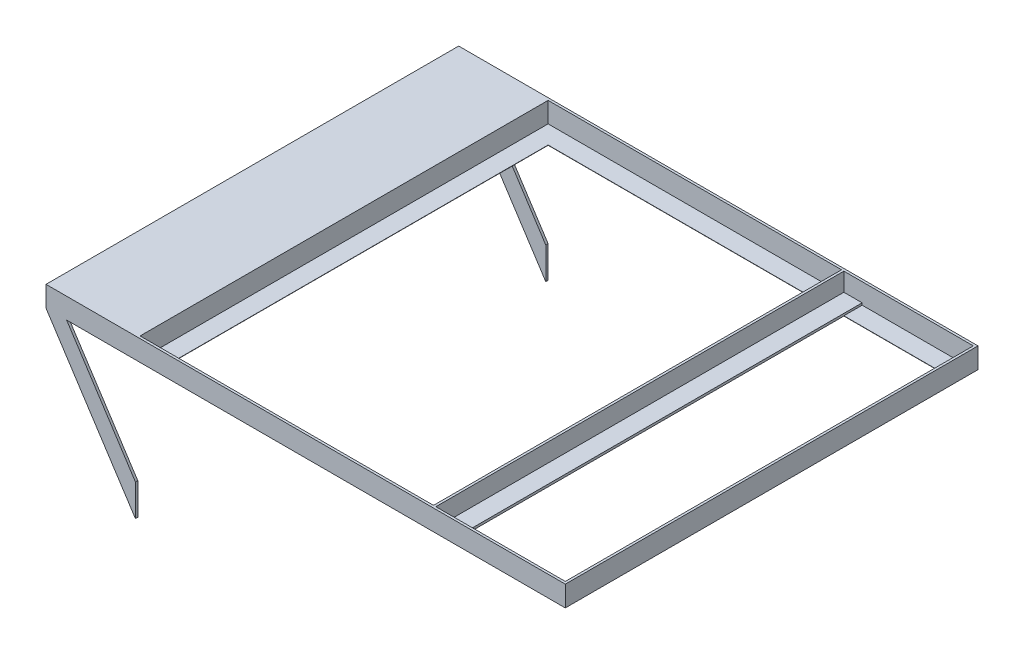
ISO-10303-21;
HEADER;
FILE_DESCRIPTION(('STEP AP214'),'2;1');
FILE_NAME('part.step','',(''),(''),'','','');
FILE_SCHEMA(('AUTOMOTIVE_DESIGN { 1 0 10303 214 1 1 1 1 }'));
ENDSEC;
DATA;
#1=APPLICATION_CONTEXT('core data for automotive mechanical design processes');
#2=APPLICATION_PROTOCOL_DEFINITION('international standard','automotive_design',2000,#1);
#3=PRODUCT_CONTEXT('',#1,'mechanical');
#4=PRODUCT('Part','Part','',(#3));
#5=PRODUCT_RELATED_PRODUCT_CATEGORY('part','',(#4));
#6=PRODUCT_DEFINITION_FORMATION('','',#4);
#7=PRODUCT_DEFINITION_CONTEXT('part definition',#1,'design');
#8=PRODUCT_DEFINITION('design','',#6,#7);
#9=PRODUCT_DEFINITION_SHAPE('','',#8);
#10=(LENGTH_UNIT() NAMED_UNIT(*) SI_UNIT(.MILLI.,.METRE.));
#11=(NAMED_UNIT(*) PLANE_ANGLE_UNIT() SI_UNIT($,.RADIAN.));
#12=(NAMED_UNIT(*) SI_UNIT($,.STERADIAN.) SOLID_ANGLE_UNIT());
#13=UNCERTAINTY_MEASURE_WITH_UNIT(LENGTH_MEASURE(1.E-05),#10,'distance_accuracy_value','');
#14=(GEOMETRIC_REPRESENTATION_CONTEXT(3) GLOBAL_UNCERTAINTY_ASSIGNED_CONTEXT((#13)) GLOBAL_UNIT_ASSIGNED_CONTEXT((#10,
#11,#12)) REPRESENTATION_CONTEXT('',''));
#15=CARTESIAN_POINT('',(0.,0.,0.));
#16=DIRECTION('',(0.,0.,1.));
#17=DIRECTION('',(1.,0.,0.));
#18=AXIS2_PLACEMENT_3D('',#15,#16,#17);
#19=CARTESIAN_POINT('',(0.,0.,0.));
#20=DIRECTION('',(0.,1.,0.));
#21=DIRECTION('',(0.,0.,1.));
#22=AXIS2_PLACEMENT_3D('',#19,#20,#21);
#23=PLANE('',#22);
#24=DIRECTION('',(0.,0.,1.));
#25=VECTOR('',#24,1.);
#26=CARTESIAN_POINT('',(182.5,0.,-300.));
#27=LINE('',#26,#25);
#28=CARTESIAN_POINT('',(182.5,0.,-270.));
#29=VERTEX_POINT('',#28);
#30=CARTESIAN_POINT('',(182.5,0.,270.));
#31=VERTEX_POINT('',#30);
#32=EDGE_CURVE('E340',#29,#31,#27,.T.);
#33=ORIENTED_EDGE('',*,*,#32,.F.);
#34=DIRECTION('',(1.,0.,0.));
#35=VECTOR('',#34,1.);
#36=CARTESIAN_POINT('',(0.,0.,-270.));
#37=LINE('',#36,#35);
#38=CARTESIAN_POINT('',(-217.5,0.,-270.));
#39=VERTEX_POINT('',#38);
#40=EDGE_CURVE('E513',#39,#29,#37,.T.);
#41=ORIENTED_EDGE('',*,*,#40,.F.);
#42=DIRECTION('',(0.,0.,1.));
#43=VECTOR('',#42,1.);
#44=CARTESIAN_POINT('',(-217.5,0.,0.));
#45=LINE('',#44,#43);
#46=CARTESIAN_POINT('',(-217.5,0.,270.));
#47=VERTEX_POINT('',#46);
#48=EDGE_CURVE('E516',#39,#47,#45,.T.);
#49=ORIENTED_EDGE('',*,*,#48,.T.);
#50=DIRECTION('',(1.,0.,0.));
#51=VECTOR('',#50,1.);
#52=CARTESIAN_POINT('',(0.,0.,270.));
#53=LINE('',#52,#51);
#54=EDGE_CURVE('E521',#47,#31,#53,.T.);
#55=ORIENTED_EDGE('',*,*,#54,.T.);
#56=EDGE_LOOP('',(#33,#41,#49,#55));
#57=FACE_BOUND('',#56,.T.);
#58=DIRECTION('',(0.,0.,1.));
#59=VECTOR('',#58,1.);
#60=CARTESIAN_POINT('',(212.5,0.,-300.));
#61=LINE('',#60,#59);
#62=CARTESIAN_POINT('',(212.5,0.,-270.));
#63=VERTEX_POINT('',#62);
#64=CARTESIAN_POINT('',(212.5,0.,270.));
#65=VERTEX_POINT('',#64);
#66=EDGE_CURVE('E336',#63,#65,#61,.T.);
#67=ORIENTED_EDGE('',*,*,#66,.T.);
#68=CARTESIAN_POINT('',(347.5,0.,270.));
#69=VERTEX_POINT('',#68);
#70=EDGE_CURVE('E520',#65,#69,#53,.T.);
#71=ORIENTED_EDGE('',*,*,#70,.T.);
#72=DIRECTION('',(0.,0.,1.));
#73=VECTOR('',#72,1.);
#74=CARTESIAN_POINT('',(347.5,0.,0.));
#75=LINE('',#74,#73);
#76=CARTESIAN_POINT('',(347.5,0.,-270.));
#77=VERTEX_POINT('',#76);
#78=EDGE_CURVE('E525',#77,#69,#75,.T.);
#79=ORIENTED_EDGE('',*,*,#78,.F.);
#80=EDGE_CURVE('E512',#63,#77,#37,.T.);
#81=ORIENTED_EDGE('',*,*,#80,.F.);
#82=EDGE_LOOP('',(#67,#71,#79,#81));
#83=FACE_BOUND('',#82,.T.);
#84=DIRECTION('',(-1.,0.,0.));
#85=VECTOR('',#84,1.);
#86=CARTESIAN_POINT('',(0.,0.,-296.6));
#87=LINE('',#86,#85);
#88=CARTESIAN_POINT('',(-347.5,0.,-296.6));
#89=VERTEX_POINT('',#88);
#90=CARTESIAN_POINT('',(-377.5,0.,-296.6));
#91=VERTEX_POINT('',#90);
#92=EDGE_CURVE('E251',#89,#91,#87,.T.);
#93=ORIENTED_EDGE('',*,*,#92,.F.);
#94=DIRECTION('',(0.,0.,-1.));
#95=VECTOR('',#94,1.);
#96=CARTESIAN_POINT('',(-347.5,0.,-296.6));
#97=LINE('',#96,#95);
#98=CARTESIAN_POINT('',(-347.5,0.,-300.));
#99=VERTEX_POINT('',#98);
#100=EDGE_CURVE('E262',#89,#99,#97,.T.);
#101=ORIENTED_EDGE('',*,*,#100,.T.);
#102=DIRECTION('',(-1.,0.,0.));
#103=VECTOR('',#102,1.);
#104=CARTESIAN_POINT('',(-377.5,0.,-300.));
#105=LINE('',#104,#103);
#106=CARTESIAN_POINT('',(377.5,0.,-300.));
#107=VERTEX_POINT('',#106);
#108=EDGE_CURVE('E488',#107,#99,#105,.T.);
#109=ORIENTED_EDGE('',*,*,#108,.F.);
#110=DIRECTION('',(0.,0.,-1.));
#111=VECTOR('',#110,1.);
#112=CARTESIAN_POINT('',(377.5,0.,-300.));
#113=LINE('',#112,#111);
#114=CARTESIAN_POINT('',(377.5,0.,300.));
#115=VERTEX_POINT('',#114);
#116=EDGE_CURVE('E460',#115,#107,#113,.T.);
#117=ORIENTED_EDGE('',*,*,#116,.F.);
#118=DIRECTION('',(1.,0.,0.));
#119=VECTOR('',#118,1.);
#120=CARTESIAN_POINT('',(-377.5,0.,300.));
#121=LINE('',#120,#119);
#122=CARTESIAN_POINT('',(-347.5,0.,300.));
#123=VERTEX_POINT('',#122);
#124=EDGE_CURVE('E475',#123,#115,#121,.T.);
#125=ORIENTED_EDGE('',*,*,#124,.F.);
#126=DIRECTION('',(0.,0.,1.));
#127=VECTOR('',#126,1.);
#128=CARTESIAN_POINT('',(-347.5,0.,296.6));
#129=LINE('',#128,#127);
#130=CARTESIAN_POINT('',(-347.5,0.,296.6));
#131=VERTEX_POINT('',#130);
#132=EDGE_CURVE('E301',#131,#123,#129,.T.);
#133=ORIENTED_EDGE('',*,*,#132,.F.);
#134=DIRECTION('',(-1.,0.,0.));
#135=VECTOR('',#134,1.);
#136=CARTESIAN_POINT('',(-377.5,0.,296.6));
#137=LINE('',#136,#135);
#138=CARTESIAN_POINT('',(-377.5,0.,296.6));
#139=VERTEX_POINT('',#138);
#140=EDGE_CURVE('E288',#131,#139,#137,.T.);
#141=ORIENTED_EDGE('',*,*,#140,.T.);
#142=DIRECTION('',(0.,0.,1.));
#143=VECTOR('',#142,1.);
#144=CARTESIAN_POINT('',(-377.5,0.,-300.));
#145=LINE('',#144,#143);
#146=EDGE_CURVE('E70',#91,#139,#145,.T.);
#147=ORIENTED_EDGE('',*,*,#146,.F.);
#148=EDGE_LOOP('',(#93,#101,#109,#117,#125,#133,#141,#147));
#149=FACE_BOUND('',#148,.T.);
#150=ADVANCED_FACE('F46',(#57,#83,#149),#23,.F.);
#151=CARTESIAN_POINT('',(0.,0.399999999999998,0.));
#152=DIRECTION('',(0.,1.,0.));
#153=DIRECTION('',(0.,0.,1.));
#154=AXIS2_PLACEMENT_3D('',#151,#152,#153);
#155=PLANE('',#154);
#156=DIRECTION('',(0.,0.,-1.));
#157=VECTOR('',#156,1.);
#158=CARTESIAN_POINT('',(212.5,0.399999999999998,0.));
#159=LINE('',#158,#157);
#160=CARTESIAN_POINT('',(212.5,0.399999999999998,296.6));
#161=VERTEX_POINT('',#160);
#162=CARTESIAN_POINT('',(212.5,0.399999999999998,270.));
#163=VERTEX_POINT('',#162);
#164=EDGE_CURVE('E367',#161,#163,#159,.T.);
#165=ORIENTED_EDGE('',*,*,#164,.F.);
#166=DIRECTION('',(1.,0.,0.));
#167=VECTOR('',#166,1.);
#168=CARTESIAN_POINT('',(0.,0.399999999999998,296.6));
#169=LINE('',#168,#167);
#170=CARTESIAN_POINT('',(374.1,0.399999999999998,296.6));
#171=VERTEX_POINT('',#170);
#172=EDGE_CURVE('E434',#161,#171,#169,.T.);
#173=ORIENTED_EDGE('',*,*,#172,.T.);
#174=DIRECTION('',(0.,0.,1.));
#175=VECTOR('',#174,1.);
#176=CARTESIAN_POINT('',(374.1,0.399999999999998,0.));
#177=LINE('',#176,#175);
#178=CARTESIAN_POINT('',(374.1,0.399999999999998,-296.6));
#179=VERTEX_POINT('',#178);
#180=EDGE_CURVE('E420',#179,#171,#177,.T.);
#181=ORIENTED_EDGE('',*,*,#180,.F.);
#182=DIRECTION('',(1.,0.,0.));
#183=VECTOR('',#182,1.);
#184=CARTESIAN_POINT('',(0.,0.399999999999998,-296.6));
#185=LINE('',#184,#183);
#186=CARTESIAN_POINT('',(212.5,0.399999999999998,-296.6));
#187=VERTEX_POINT('',#186);
#188=EDGE_CURVE('E424',#187,#179,#185,.T.);
#189=ORIENTED_EDGE('',*,*,#188,.F.);
#190=CARTESIAN_POINT('',(212.5,0.399999999999998,-270.));
#191=VERTEX_POINT('',#190);
#192=EDGE_CURVE('E362',#191,#187,#159,.T.);
#193=ORIENTED_EDGE('',*,*,#192,.F.);
#194=DIRECTION('',(1.,0.,0.));
#195=VECTOR('',#194,1.);
#196=CARTESIAN_POINT('',(0.,0.399999999999998,-270.));
#197=LINE('',#196,#195);
#198=CARTESIAN_POINT('',(347.5,0.399999999999998,-270.));
#199=VERTEX_POINT('',#198);
#200=EDGE_CURVE('E391',#191,#199,#197,.T.);
#201=ORIENTED_EDGE('',*,*,#200,.T.);
#202=DIRECTION('',(0.,0.,1.));
#203=VECTOR('',#202,1.);
#204=CARTESIAN_POINT('',(347.5,0.399999999999998,0.));
#205=LINE('',#204,#203);
#206=CARTESIAN_POINT('',(347.5,0.399999999999998,270.));
#207=VERTEX_POINT('',#206);
#208=EDGE_CURVE('E387',#199,#207,#205,.T.);
#209=ORIENTED_EDGE('',*,*,#208,.T.);
#210=DIRECTION('',(1.,0.,0.));
#211=VECTOR('',#210,1.);
#212=CARTESIAN_POINT('',(0.,0.399999999999998,270.));
#213=LINE('',#212,#211);
#214=EDGE_CURVE('E399',#163,#207,#213,.T.);
#215=ORIENTED_EDGE('',*,*,#214,.F.);
#216=EDGE_LOOP('',(#165,#173,#181,#189,#193,#201,#209,#215));
#217=FACE_BOUND('',#216,.T.);
#218=ADVANCED_FACE('F596',(#217),#155,.T.);
#219=CARTESIAN_POINT('',(0.,0.399999999999998,296.6));
#220=DIRECTION('',(0.,0.,1.));
#221=DIRECTION('',(1.,0.,0.));
#222=AXIS2_PLACEMENT_3D('',#219,#220,#221);
#223=PLANE('',#222);
#224=DIRECTION('',(-1.,0.,0.));
#225=VECTOR('',#224,1.);
#226=CARTESIAN_POINT('',(0.,3.4,296.6));
#227=LINE('',#226,#225);
#228=CARTESIAN_POINT('',(212.5,3.4,296.6));
#229=VERTEX_POINT('',#228);
#230=CARTESIAN_POINT('',(185.9,3.4,296.6));
#231=VERTEX_POINT('',#230);
#232=EDGE_CURVE('E379',#229,#231,#227,.T.);
#233=ORIENTED_EDGE('',*,*,#232,.T.);
#234=DIRECTION('',(0.,1.,0.));
#235=VECTOR('',#234,1.);
#236=CARTESIAN_POINT('',(185.9,0.399999999999998,296.6));
#237=LINE('',#236,#235);
#238=CARTESIAN_POINT('',(185.9,30.,296.6));
#239=VERTEX_POINT('',#238);
#240=EDGE_CURVE('E383',#231,#239,#237,.T.);
#241=ORIENTED_EDGE('',*,*,#240,.T.);
#242=DIRECTION('',(1.,0.,0.));
#243=VECTOR('',#242,1.);
#244=CARTESIAN_POINT('',(0.,30.,296.6));
#245=LINE('',#244,#243);
#246=CARTESIAN_POINT('',(374.1,30.,296.6));
#247=VERTEX_POINT('',#246);
#248=EDGE_CURVE('E452',#239,#247,#245,.T.);
#249=ORIENTED_EDGE('',*,*,#248,.T.);
#250=DIRECTION('',(0.,1.,0.));
#251=VECTOR('',#250,1.);
#252=CARTESIAN_POINT('',(374.1,0.399999999999998,296.6));
#253=LINE('',#252,#251);
#254=EDGE_CURVE('E456',#171,#247,#253,.T.);
#255=ORIENTED_EDGE('',*,*,#254,.F.);
#256=ORIENTED_EDGE('',*,*,#172,.F.);
#257=DIRECTION('',(0.,1.,0.));
#258=VECTOR('',#257,1.);
#259=CARTESIAN_POINT('',(212.5,0.399999999999998,296.6));
#260=LINE('',#259,#258);
#261=EDGE_CURVE('E375',#161,#229,#260,.T.);
#262=ORIENTED_EDGE('',*,*,#261,.T.);
#263=EDGE_LOOP('',(#233,#241,#249,#255,#256,#262));
#264=FACE_BOUND('',#263,.T.);
#265=ADVANCED_FACE('F548',(#264),#223,.F.);
#266=CARTESIAN_POINT('',(0.,0.399999999999998,-296.6));
#267=DIRECTION('',(0.,0.,1.));
#268=DIRECTION('',(1.,0.,0.));
#269=AXIS2_PLACEMENT_3D('',#266,#267,#268);
#270=PLANE('',#269);
#271=DIRECTION('',(0.,1.,0.));
#272=VECTOR('',#271,1.);
#273=CARTESIAN_POINT('',(185.9,0.399999999999998,-296.6));
#274=LINE('',#273,#272);
#275=CARTESIAN_POINT('',(185.9,3.4,-296.6));
#276=VERTEX_POINT('',#275);
#277=CARTESIAN_POINT('',(185.9,30.,-296.6));
#278=VERTEX_POINT('',#277);
#279=EDGE_CURVE('E11',#276,#278,#274,.T.);
#280=ORIENTED_EDGE('',*,*,#279,.F.);
#281=DIRECTION('',(-1.,0.,0.));
#282=VECTOR('',#281,1.);
#283=CARTESIAN_POINT('',(0.,3.4,-296.6));
#284=LINE('',#283,#282);
#285=CARTESIAN_POINT('',(212.5,3.4,-296.6));
#286=VERTEX_POINT('',#285);
#287=EDGE_CURVE('E55',#286,#276,#284,.T.);
#288=ORIENTED_EDGE('',*,*,#287,.F.);
#289=DIRECTION('',(0.,1.,0.));
#290=VECTOR('',#289,1.);
#291=CARTESIAN_POINT('',(212.5,0.399999999999998,-296.6));
#292=LINE('',#291,#290);
#293=EDGE_CURVE('E366',#187,#286,#292,.T.);
#294=ORIENTED_EDGE('',*,*,#293,.F.);
#295=ORIENTED_EDGE('',*,*,#188,.T.);
#296=DIRECTION('',(0.,1.,0.));
#297=VECTOR('',#296,1.);
#298=CARTESIAN_POINT('',(374.1,0.399999999999998,-296.6));
#299=LINE('',#298,#297);
#300=CARTESIAN_POINT('',(374.1,30.,-296.6));
#301=VERTEX_POINT('',#300);
#302=EDGE_CURVE('E439',#179,#301,#299,.T.);
#303=ORIENTED_EDGE('',*,*,#302,.T.);
#304=DIRECTION('',(1.,0.,0.));
#305=VECTOR('',#304,1.);
#306=CARTESIAN_POINT('',(0.,30.,-296.6));
#307=LINE('',#306,#305);
#308=EDGE_CURVE('E443',#278,#301,#307,.T.);
#309=ORIENTED_EDGE('',*,*,#308,.F.);
#310=EDGE_LOOP('',(#280,#288,#294,#295,#303,#309));
#311=FACE_BOUND('',#310,.T.);
#312=ADVANCED_FACE('F583',(#311),#270,.T.);
#313=CARTESIAN_POINT('',(0.,-29.2,270.));
#314=DIRECTION('',(0.,0.,1.));
#315=DIRECTION('',(1.,0.,0.));
#316=AXIS2_PLACEMENT_3D('',#313,#314,#315);
#317=PLANE('',#316);
#318=ORIENTED_EDGE('',*,*,#70,.F.);
#319=DIRECTION('',(0.,1.,0.));
#320=VECTOR('',#319,1.);
#321=CARTESIAN_POINT('',(212.5,-29.2,270.));
#322=LINE('',#321,#320);
#323=EDGE_CURVE('E371',#65,#163,#322,.T.);
#324=ORIENTED_EDGE('',*,*,#323,.T.);
#325=ORIENTED_EDGE('',*,*,#214,.T.);
#326=DIRECTION('',(0.,1.,0.));
#327=VECTOR('',#326,1.);
#328=CARTESIAN_POINT('',(347.5,-29.2,270.));
#329=LINE('',#328,#327);
#330=EDGE_CURVE('E405',#69,#207,#329,.T.);
#331=ORIENTED_EDGE('',*,*,#330,.F.);
#332=EDGE_LOOP('',(#318,#324,#325,#331));
#333=FACE_BOUND('',#332,.T.);
#334=ADVANCED_FACE('F594',(#333),#317,.F.);
#335=CARTESIAN_POINT('',(0.,-29.2,-270.));
#336=DIRECTION('',(0.,0.,1.));
#337=DIRECTION('',(1.,0.,0.));
#338=AXIS2_PLACEMENT_3D('',#335,#336,#337);
#339=PLANE('',#338);
#340=DIRECTION('',(0.,1.,0.));
#341=VECTOR('',#340,1.);
#342=CARTESIAN_POINT('',(212.5,-29.2,-270.));
#343=LINE('',#342,#341);
#344=EDGE_CURVE('E533',#63,#191,#343,.T.);
#345=ORIENTED_EDGE('',*,*,#344,.F.);
#346=ORIENTED_EDGE('',*,*,#80,.T.);
#347=DIRECTION('',(0.,1.,0.));
#348=VECTOR('',#347,1.);
#349=CARTESIAN_POINT('',(347.5,-29.2,-270.));
#350=LINE('',#349,#348);
#351=EDGE_CURVE('E404',#77,#199,#350,.T.);
#352=ORIENTED_EDGE('',*,*,#351,.T.);
#353=ORIENTED_EDGE('',*,*,#200,.F.);
#354=EDGE_LOOP('',(#345,#346,#352,#353));
#355=FACE_BOUND('',#354,.T.);
#356=ADVANCED_FACE('F682',(#355),#339,.T.);
#357=DIRECTION('',(0.,0.,1.));
#358=VECTOR('',#357,1.);
#359=CARTESIAN_POINT('',(182.5,0.399999999999998,0.));
#360=LINE('',#359,#358);
#361=CARTESIAN_POINT('',(182.5,0.399999999999998,-296.6));
#362=VERTEX_POINT('',#361);
#363=CARTESIAN_POINT('',(182.5,0.399999999999998,-270.));
#364=VERTEX_POINT('',#363);
#365=EDGE_CURVE('E327',#362,#364,#360,.T.);
#366=ORIENTED_EDGE('',*,*,#365,.F.);
#367=CARTESIAN_POINT('',(-244.1,0.399999999999998,-296.6));
#368=VERTEX_POINT('',#367);
#369=EDGE_CURVE('E426',#368,#362,#185,.T.);
#370=ORIENTED_EDGE('',*,*,#369,.F.);
#371=DIRECTION('',(0.,0.,1.));
#372=VECTOR('',#371,1.);
#373=CARTESIAN_POINT('',(-244.1,0.399999999999998,0.));
#374=LINE('',#373,#372);
#375=CARTESIAN_POINT('',(-244.1,0.399999999999998,296.6));
#376=VERTEX_POINT('',#375);
#377=EDGE_CURVE('E430',#368,#376,#374,.T.);
#378=ORIENTED_EDGE('',*,*,#377,.T.);
#379=CARTESIAN_POINT('',(182.5,0.399999999999998,296.6));
#380=VERTEX_POINT('',#379);
#381=EDGE_CURVE('E435',#376,#380,#169,.T.);
#382=ORIENTED_EDGE('',*,*,#381,.T.);
#383=CARTESIAN_POINT('',(182.5,0.399999999999998,270.));
#384=VERTEX_POINT('',#383);
#385=EDGE_CURVE('E350',#384,#380,#360,.T.);
#386=ORIENTED_EDGE('',*,*,#385,.F.);
#387=CARTESIAN_POINT('',(-217.5,0.399999999999998,270.));
#388=VERTEX_POINT('',#387);
#389=EDGE_CURVE('E400',#388,#384,#213,.T.);
#390=ORIENTED_EDGE('',*,*,#389,.F.);
#391=DIRECTION('',(0.,0.,1.));
#392=VECTOR('',#391,1.);
#393=CARTESIAN_POINT('',(-217.5,0.399999999999998,0.));
#394=LINE('',#393,#392);
#395=CARTESIAN_POINT('',(-217.5,0.399999999999998,-270.));
#396=VERTEX_POINT('',#395);
#397=EDGE_CURVE('E396',#396,#388,#394,.T.);
#398=ORIENTED_EDGE('',*,*,#397,.F.);
#399=EDGE_CURVE('E392',#396,#364,#197,.T.);
#400=ORIENTED_EDGE('',*,*,#399,.T.);
#401=EDGE_LOOP('',(#366,#370,#378,#382,#386,#390,#398,#400));
#402=FACE_BOUND('',#401,.T.);
#403=ADVANCED_FACE('F570',(#402),#155,.T.);
#404=CARTESIAN_POINT('',(0.,30.,0.));
#405=DIRECTION('',(0.,1.,0.));
#406=DIRECTION('',(0.,0.,1.));
#407=AXIS2_PLACEMENT_3D('',#404,#405,#406);
#408=PLANE('',#407);
#409=ORIENTED_EDGE('',*,*,#248,.F.);
#410=DIRECTION('',(0.,0.,1.));
#411=VECTOR('',#410,1.);
#412=CARTESIAN_POINT('',(185.9,30.,-300.));
#413=LINE('',#412,#411);
#414=EDGE_CURVE('E324',#278,#239,#413,.T.);
#415=ORIENTED_EDGE('',*,*,#414,.F.);
#416=ORIENTED_EDGE('',*,*,#308,.T.);
#417=DIRECTION('',(0.,0.,1.));
#418=VECTOR('',#417,1.);
#419=CARTESIAN_POINT('',(374.1,30.,0.));
#420=LINE('',#419,#418);
#421=EDGE_CURVE('E409',#301,#247,#420,.T.);
#422=ORIENTED_EDGE('',*,*,#421,.T.);
#423=EDGE_LOOP('',(#409,#415,#416,#422));
#424=FACE_BOUND('',#423,.T.);
#425=CARTESIAN_POINT('',(-244.1,30.,-296.6));
#426=VERTEX_POINT('',#425);
#427=CARTESIAN_POINT('',(182.5,30.,-296.6));
#428=VERTEX_POINT('',#427);
#429=EDGE_CURVE('E444',#426,#428,#307,.T.);
#430=ORIENTED_EDGE('',*,*,#429,.T.);
#431=DIRECTION('',(0.,0.,1.));
#432=VECTOR('',#431,1.);
#433=CARTESIAN_POINT('',(182.5,30.,-300.));
#434=LINE('',#433,#432);
#435=CARTESIAN_POINT('',(182.5,30.,296.6));
#436=VERTEX_POINT('',#435);
#437=EDGE_CURVE('E315',#428,#436,#434,.T.);
#438=ORIENTED_EDGE('',*,*,#437,.T.);
#439=CARTESIAN_POINT('',(-244.1,30.,296.6));
#440=VERTEX_POINT('',#439);
#441=EDGE_CURVE('E425',#440,#436,#245,.T.);
#442=ORIENTED_EDGE('',*,*,#441,.F.);
#443=DIRECTION('',(0.,0.,1.));
#444=VECTOR('',#443,1.);
#445=CARTESIAN_POINT('',(-244.1,30.,0.));
#446=LINE('',#445,#444);
#447=EDGE_CURVE('E448',#426,#440,#446,.T.);
#448=ORIENTED_EDGE('',*,*,#447,.F.);
#449=EDGE_LOOP('',(#430,#438,#442,#448));
#450=FACE_BOUND('',#449,.T.);
#451=DIRECTION('',(-1.,0.,0.));
#452=VECTOR('',#451,1.);
#453=CARTESIAN_POINT('',(-377.5,30.,-300.));
#454=LINE('',#453,#452);
#455=CARTESIAN_POINT('',(377.5,30.,-300.));
#456=VERTEX_POINT('',#455);
#457=CARTESIAN_POINT('',(-377.5,30.,-300.));
#458=VERTEX_POINT('',#457);
#459=EDGE_CURVE('E474',#456,#458,#454,.T.);
#460=ORIENTED_EDGE('',*,*,#459,.T.);
#461=DIRECTION('',(0.,0.,1.));
#462=VECTOR('',#461,1.);
#463=CARTESIAN_POINT('',(-377.5,30.,-300.));
#464=LINE('',#463,#462);
#465=CARTESIAN_POINT('',(-377.5,30.,300.));
#466=VERTEX_POINT('',#465);
#467=EDGE_CURVE('E478',#458,#466,#464,.T.);
#468=ORIENTED_EDGE('',*,*,#467,.T.);
#469=DIRECTION('',(1.,0.,0.));
#470=VECTOR('',#469,1.);
#471=CARTESIAN_POINT('',(-377.5,30.,300.));
#472=LINE('',#471,#470);
#473=CARTESIAN_POINT('',(377.5,30.,300.));
#474=VERTEX_POINT('',#473);
#475=EDGE_CURVE('E481',#466,#474,#472,.T.);
#476=ORIENTED_EDGE('',*,*,#475,.T.);
#477=DIRECTION('',(0.,0.,-1.));
#478=VECTOR('',#477,1.);
#479=CARTESIAN_POINT('',(377.5,30.,-300.));
#480=LINE('',#479,#478);
#481=EDGE_CURVE('E470',#474,#456,#480,.T.);
#482=ORIENTED_EDGE('',*,*,#481,.T.);
#483=EDGE_LOOP('',(#460,#468,#476,#482));
#484=FACE_BOUND('',#483,.T.);
#485=ADVANCED_FACE('F551',(#424,#450,#484),#408,.T.);
#486=CARTESIAN_POINT('',(377.5,30.,-300.));
#487=DIRECTION('',(-1.,0.,0.));
#488=DIRECTION('',(0.,0.,1.));
#489=AXIS2_PLACEMENT_3D('',#486,#487,#488);
#490=PLANE('',#489);
#491=ORIENTED_EDGE('',*,*,#116,.T.);
#492=DIRECTION('',(0.,-1.,0.));
#493=VECTOR('',#492,1.);
#494=CARTESIAN_POINT('',(377.5,30.,-300.));
#495=LINE('',#494,#493);
#496=EDGE_CURVE('E508',#456,#107,#495,.T.);
#497=ORIENTED_EDGE('',*,*,#496,.F.);
#498=ORIENTED_EDGE('',*,*,#481,.F.);
#499=DIRECTION('',(0.,-1.,0.));
#500=VECTOR('',#499,1.);
#501=CARTESIAN_POINT('',(377.5,30.,300.));
#502=LINE('',#501,#500);
#503=EDGE_CURVE('E484',#474,#115,#502,.T.);
#504=ORIENTED_EDGE('',*,*,#503,.T.);
#505=EDGE_LOOP('',(#491,#497,#498,#504));
#506=FACE_BOUND('',#505,.T.);
#507=ADVANCED_FACE('F48',(#506),#490,.F.);
#508=CARTESIAN_POINT('',(-377.5,30.,-300.));
#509=DIRECTION('',(0.,0.,1.));
#510=DIRECTION('',(1.,0.,0.));
#511=AXIS2_PLACEMENT_3D('',#508,#509,#510);
#512=PLANE('',#511);
#513=DIRECTION('',(0.,-1.,0.));
#514=VECTOR('',#513,1.);
#515=CARTESIAN_POINT('',(-377.5,30.,-300.));
#516=LINE('',#515,#514);
#517=CARTESIAN_POINT('',(-377.5,0.,-300.));
#518=VERTEX_POINT('',#517);
#519=EDGE_CURVE('E504',#458,#518,#516,.T.);
#520=ORIENTED_EDGE('',*,*,#519,.F.);
#521=ORIENTED_EDGE('',*,*,#459,.F.);
#522=ORIENTED_EDGE('',*,*,#496,.T.);
#523=ORIENTED_EDGE('',*,*,#108,.T.);
#524=DIRECTION('',(0.544988350595414,-0.838443616300637,0.));
#525=VECTOR('',#524,1.);
#526=CARTESIAN_POINT('',(-244.288224956063,-158.787346221441,-300.));
#527=LINE('',#526,#525);
#528=CARTESIAN_POINT('',(-247.5,-153.846153846154,-300.));
#529=VERTEX_POINT('',#528);
#530=EDGE_CURVE('E274',#99,#529,#527,.T.);
#531=ORIENTED_EDGE('',*,*,#530,.T.);
#532=DIRECTION('',(0.,-1.,0.));
#533=VECTOR('',#532,1.);
#534=CARTESIAN_POINT('',(-247.5,1.4883927423881E-13,-300.));
#535=LINE('',#534,#533);
#536=CARTESIAN_POINT('',(-247.5,-200.,-300.));
#537=VERTEX_POINT('',#536);
#538=EDGE_CURVE('E245',#529,#537,#535,.T.);
#539=ORIENTED_EDGE('',*,*,#538,.T.);
#540=DIRECTION('',(0.544988350595414,-0.838443616300637,0.));
#541=VECTOR('',#540,1.);
#542=CARTESIAN_POINT('',(-265.377855887522,-172.495606326889,-300.));
#543=LINE('',#542,#541);
#544=EDGE_CURVE('E264',#518,#537,#543,.T.);
#545=ORIENTED_EDGE('',*,*,#544,.F.);
#546=EDGE_LOOP('',(#520,#521,#522,#523,#531,#539,#545));
#547=FACE_BOUND('',#546,.T.);
#548=ADVANCED_FACE('F615',(#547),#512,.F.);
#549=CARTESIAN_POINT('',(-377.5,30.,-300.));
#550=DIRECTION('',(1.,0.,0.));
#551=DIRECTION('',(0.,0.,-1.));
#552=AXIS2_PLACEMENT_3D('',#549,#550,#551);
#553=PLANE('',#552);
#554=EDGE_CURVE('E492',#518,#91,#145,.T.);
#555=ORIENTED_EDGE('',*,*,#554,.T.);
#556=ORIENTED_EDGE('',*,*,#146,.T.);
#557=DIRECTION('',(0.,0.,1.));
#558=VECTOR('',#557,1.);
#559=CARTESIAN_POINT('',(-377.5,0.,296.6));
#560=LINE('',#559,#558);
#561=CARTESIAN_POINT('',(-377.5,0.,300.));
#562=VERTEX_POINT('',#561);
#563=EDGE_CURVE('E319',#139,#562,#560,.T.);
#564=ORIENTED_EDGE('',*,*,#563,.T.);
#565=DIRECTION('',(0.,-1.,0.));
#566=VECTOR('',#565,1.);
#567=CARTESIAN_POINT('',(-377.5,30.,300.));
#568=LINE('',#567,#566);
#569=EDGE_CURVE('E500',#466,#562,#568,.T.);
#570=ORIENTED_EDGE('',*,*,#569,.F.);
#571=ORIENTED_EDGE('',*,*,#467,.F.);
#572=ORIENTED_EDGE('',*,*,#519,.T.);
#573=EDGE_LOOP('',(#555,#556,#564,#570,#571,#572));
#574=FACE_BOUND('',#573,.T.);
#575=ADVANCED_FACE('F612',(#574),#553,.F.);
#576=CARTESIAN_POINT('',(-377.5,30.,300.));
#577=DIRECTION('',(0.,0.,-1.));
#578=DIRECTION('',(-1.,0.,0.));
#579=AXIS2_PLACEMENT_3D('',#576,#577,#578);
#580=PLANE('',#579);
#581=ORIENTED_EDGE('',*,*,#569,.T.);
#582=DIRECTION('',(0.544988350595414,-0.838443616300637,0.));
#583=VECTOR('',#582,1.);
#584=CARTESIAN_POINT('',(-377.5,0.,300.));
#585=LINE('',#584,#583);
#586=CARTESIAN_POINT('',(-247.5,-200.,300.));
#587=VERTEX_POINT('',#586);
#588=EDGE_CURVE('E305',#562,#587,#585,.T.);
#589=ORIENTED_EDGE('',*,*,#588,.T.);
#590=DIRECTION('',(0.,1.,0.));
#591=VECTOR('',#590,1.);
#592=CARTESIAN_POINT('',(-247.5,-153.846153846154,300.));
#593=LINE('',#592,#591);
#594=CARTESIAN_POINT('',(-247.5,-153.846153846154,300.));
#595=VERTEX_POINT('',#594);
#596=EDGE_CURVE('E289',#587,#595,#593,.T.);
#597=ORIENTED_EDGE('',*,*,#596,.T.);
#598=DIRECTION('',(-0.544988350595414,0.838443616300637,0.));
#599=VECTOR('',#598,1.);
#600=CARTESIAN_POINT('',(-347.5,0.,300.));
#601=LINE('',#600,#599);
#602=EDGE_CURVE('E281',#595,#123,#601,.T.);
#603=ORIENTED_EDGE('',*,*,#602,.T.);
#604=ORIENTED_EDGE('',*,*,#124,.T.);
#605=ORIENTED_EDGE('',*,*,#503,.F.);
#606=ORIENTED_EDGE('',*,*,#475,.F.);
#607=EDGE_LOOP('',(#581,#589,#597,#603,#604,#605,#606));
#608=FACE_BOUND('',#607,.T.);
#609=ADVANCED_FACE('F608',(#608),#580,.F.);
#610=CARTESIAN_POINT('',(374.1,0.399999999999998,0.));
#611=DIRECTION('',(-1.,0.,0.));
#612=DIRECTION('',(0.,0.,1.));
#613=AXIS2_PLACEMENT_3D('',#610,#611,#612);
#614=PLANE('',#613);
#615=ORIENTED_EDGE('',*,*,#421,.F.);
#616=ORIENTED_EDGE('',*,*,#302,.F.);
#617=ORIENTED_EDGE('',*,*,#180,.T.);
#618=ORIENTED_EDGE('',*,*,#254,.T.);
#619=EDGE_LOOP('',(#615,#616,#617,#618));
#620=FACE_BOUND('',#619,.T.);
#621=ADVANCED_FACE('F611',(#620),#614,.T.);
#622=ORIENTED_EDGE('',*,*,#441,.T.);
#623=DIRECTION('',(0.,-1.,0.));
#624=VECTOR('',#623,1.);
#625=CARTESIAN_POINT('',(182.5,0.399999999999998,296.6));
#626=LINE('',#625,#624);
#627=EDGE_CURVE('E358',#436,#380,#626,.T.);
#628=ORIENTED_EDGE('',*,*,#627,.T.);
#629=ORIENTED_EDGE('',*,*,#381,.F.);
#630=DIRECTION('',(0.,1.,0.));
#631=VECTOR('',#630,1.);
#632=CARTESIAN_POINT('',(-244.1,0.399999999999998,296.6));
#633=LINE('',#632,#631);
#634=EDGE_CURVE('E461',#376,#440,#633,.T.);
#635=ORIENTED_EDGE('',*,*,#634,.T.);
#636=EDGE_LOOP('',(#622,#628,#629,#635));
#637=FACE_BOUND('',#636,.T.);
#638=ADVANCED_FACE('F568',(#637),#223,.F.);
#639=CARTESIAN_POINT('',(-244.1,0.399999999999998,0.));
#640=DIRECTION('',(-1.,0.,0.));
#641=DIRECTION('',(0.,0.,1.));
#642=AXIS2_PLACEMENT_3D('',#639,#640,#641);
#643=PLANE('',#642);
#644=ORIENTED_EDGE('',*,*,#447,.T.);
#645=ORIENTED_EDGE('',*,*,#634,.F.);
#646=ORIENTED_EDGE('',*,*,#377,.F.);
#647=DIRECTION('',(0.,1.,0.));
#648=VECTOR('',#647,1.);
#649=CARTESIAN_POINT('',(-244.1,0.399999999999998,-296.6));
#650=LINE('',#649,#648);
#651=EDGE_CURVE('E464',#368,#426,#650,.T.);
#652=ORIENTED_EDGE('',*,*,#651,.T.);
#653=EDGE_LOOP('',(#644,#645,#646,#652));
#654=FACE_BOUND('',#653,.T.);
#655=ADVANCED_FACE('F574',(#654),#643,.F.);
#656=DIRECTION('',(0.,-1.,0.));
#657=VECTOR('',#656,1.);
#658=CARTESIAN_POINT('',(182.5,0.399999999999998,-296.6));
#659=LINE('',#658,#657);
#660=EDGE_CURVE('E349',#428,#362,#659,.T.);
#661=ORIENTED_EDGE('',*,*,#660,.F.);
#662=ORIENTED_EDGE('',*,*,#429,.F.);
#663=ORIENTED_EDGE('',*,*,#651,.F.);
#664=ORIENTED_EDGE('',*,*,#369,.T.);
#665=EDGE_LOOP('',(#661,#662,#663,#664));
#666=FACE_BOUND('',#665,.T.);
#667=ADVANCED_FACE('F579',(#666),#270,.T.);
#668=CARTESIAN_POINT('',(347.5,-29.2,0.));
#669=DIRECTION('',(-1.,0.,0.));
#670=DIRECTION('',(0.,0.,1.));
#671=AXIS2_PLACEMENT_3D('',#668,#669,#670);
#672=PLANE('',#671);
#673=ORIENTED_EDGE('',*,*,#78,.T.);
#674=ORIENTED_EDGE('',*,*,#330,.T.);
#675=ORIENTED_EDGE('',*,*,#208,.F.);
#676=ORIENTED_EDGE('',*,*,#351,.F.);
#677=EDGE_LOOP('',(#673,#674,#675,#676));
#678=FACE_BOUND('',#677,.T.);
#679=ADVANCED_FACE('F581',(#678),#672,.T.);
#680=ORIENTED_EDGE('',*,*,#389,.T.);
#681=DIRECTION('',(0.,-1.,0.));
#682=VECTOR('',#681,1.);
#683=CARTESIAN_POINT('',(182.5,-29.2,270.));
#684=LINE('',#683,#682);
#685=EDGE_CURVE('E354',#384,#31,#684,.T.);
#686=ORIENTED_EDGE('',*,*,#685,.T.);
#687=ORIENTED_EDGE('',*,*,#54,.F.);
#688=DIRECTION('',(0.,1.,0.));
#689=VECTOR('',#688,1.);
#690=CARTESIAN_POINT('',(-217.5,-29.2,270.));
#691=LINE('',#690,#689);
#692=EDGE_CURVE('E410',#47,#388,#691,.T.);
#693=ORIENTED_EDGE('',*,*,#692,.T.);
#694=EDGE_LOOP('',(#680,#686,#687,#693));
#695=FACE_BOUND('',#694,.T.);
#696=ADVANCED_FACE('F588',(#695),#317,.F.);
#697=CARTESIAN_POINT('',(-217.5,-29.2,0.));
#698=DIRECTION('',(-1.,0.,0.));
#699=DIRECTION('',(0.,0.,1.));
#700=AXIS2_PLACEMENT_3D('',#697,#698,#699);
#701=PLANE('',#700);
#702=DIRECTION('',(0.,1.,0.));
#703=VECTOR('',#702,1.);
#704=CARTESIAN_POINT('',(-217.5,-29.2,-270.));
#705=LINE('',#704,#703);
#706=EDGE_CURVE('E414',#39,#396,#705,.T.);
#707=ORIENTED_EDGE('',*,*,#706,.T.);
#708=ORIENTED_EDGE('',*,*,#397,.T.);
#709=ORIENTED_EDGE('',*,*,#692,.F.);
#710=ORIENTED_EDGE('',*,*,#48,.F.);
#711=EDGE_LOOP('',(#707,#708,#709,#710));
#712=FACE_BOUND('',#711,.T.);
#713=ADVANCED_FACE('F675',(#712),#701,.F.);
#714=DIRECTION('',(0.,-1.,0.));
#715=VECTOR('',#714,1.);
#716=CARTESIAN_POINT('',(182.5,-29.2,-270.));
#717=LINE('',#716,#715);
#718=EDGE_CURVE('E529',#364,#29,#717,.T.);
#719=ORIENTED_EDGE('',*,*,#718,.F.);
#720=ORIENTED_EDGE('',*,*,#399,.F.);
#721=ORIENTED_EDGE('',*,*,#706,.F.);
#722=ORIENTED_EDGE('',*,*,#40,.T.);
#723=EDGE_LOOP('',(#719,#720,#721,#722));
#724=FACE_BOUND('',#723,.T.);
#725=ADVANCED_FACE('F664',(#724),#339,.T.);
#726=CARTESIAN_POINT('',(185.9,30.,-300.));
#727=DIRECTION('',(1.,0.,0.));
#728=DIRECTION('',(0.,0.,-1.));
#729=AXIS2_PLACEMENT_3D('',#726,#727,#728);
#730=PLANE('',#729);
#731=ORIENTED_EDGE('',*,*,#240,.F.);
#732=DIRECTION('',(0.,0.,1.));
#733=VECTOR('',#732,1.);
#734=CARTESIAN_POINT('',(185.9,3.4,-300.));
#735=LINE('',#734,#733);
#736=EDGE_CURVE('E328',#276,#231,#735,.T.);
#737=ORIENTED_EDGE('',*,*,#736,.F.);
#738=ORIENTED_EDGE('',*,*,#279,.T.);
#739=ORIENTED_EDGE('',*,*,#414,.T.);
#740=EDGE_LOOP('',(#731,#737,#738,#739));
#741=FACE_BOUND('',#740,.T.);
#742=ADVANCED_FACE('F544',(#741),#730,.T.);
#743=CARTESIAN_POINT('',(185.9,3.4,-300.));
#744=DIRECTION('',(0.,1.,0.));
#745=DIRECTION('',(0.,0.,1.));
#746=AXIS2_PLACEMENT_3D('',#743,#744,#745);
#747=PLANE('',#746);
#748=ORIENTED_EDGE('',*,*,#232,.F.);
#749=DIRECTION('',(0.,0.,1.));
#750=VECTOR('',#749,1.);
#751=CARTESIAN_POINT('',(212.5,3.4,-300.));
#752=LINE('',#751,#750);
#753=EDGE_CURVE('E332',#286,#229,#752,.T.);
#754=ORIENTED_EDGE('',*,*,#753,.F.);
#755=ORIENTED_EDGE('',*,*,#287,.T.);
#756=ORIENTED_EDGE('',*,*,#736,.T.);
#757=EDGE_LOOP('',(#748,#754,#755,#756));
#758=FACE_BOUND('',#757,.T.);
#759=ADVANCED_FACE('F541',(#758),#747,.T.);
#760=CARTESIAN_POINT('',(212.5,0.,-300.));
#761=DIRECTION('',(1.,0.,0.));
#762=DIRECTION('',(0.,0.,-1.));
#763=AXIS2_PLACEMENT_3D('',#760,#761,#762);
#764=PLANE('',#763);
#765=ORIENTED_EDGE('',*,*,#261,.F.);
#766=ORIENTED_EDGE('',*,*,#164,.T.);
#767=ORIENTED_EDGE('',*,*,#323,.F.);
#768=ORIENTED_EDGE('',*,*,#66,.F.);
#769=ORIENTED_EDGE('',*,*,#344,.T.);
#770=ORIENTED_EDGE('',*,*,#192,.T.);
#771=ORIENTED_EDGE('',*,*,#293,.T.);
#772=ORIENTED_EDGE('',*,*,#753,.T.);
#773=EDGE_LOOP('',(#765,#766,#767,#768,#769,#770,#771,#772));
#774=FACE_BOUND('',#773,.T.);
#775=ADVANCED_FACE('F667',(#774),#764,.T.);
#776=CARTESIAN_POINT('',(182.5,30.,-300.));
#777=DIRECTION('',(-1.,0.,0.));
#778=DIRECTION('',(0.,0.,1.));
#779=AXIS2_PLACEMENT_3D('',#776,#777,#778);
#780=PLANE('',#779);
#781=ORIENTED_EDGE('',*,*,#627,.F.);
#782=ORIENTED_EDGE('',*,*,#437,.F.);
#783=ORIENTED_EDGE('',*,*,#660,.T.);
#784=ORIENTED_EDGE('',*,*,#365,.T.);
#785=ORIENTED_EDGE('',*,*,#718,.T.);
#786=ORIENTED_EDGE('',*,*,#32,.T.);
#787=ORIENTED_EDGE('',*,*,#685,.F.);
#788=ORIENTED_EDGE('',*,*,#385,.T.);
#789=EDGE_LOOP('',(#781,#782,#783,#784,#785,#786,#787,#788));
#790=FACE_BOUND('',#789,.T.);
#791=ADVANCED_FACE('F562',(#790),#780,.T.);
#792=CARTESIAN_POINT('',(-347.5,0.,296.6));
#793=DIRECTION('',(0.838443616300637,0.544988350595414,0.));
#794=DIRECTION('',(-0.544988350595414,0.838443616300637,0.));
#795=AXIS2_PLACEMENT_3D('',#792,#793,#794);
#796=PLANE('',#795);
#797=ORIENTED_EDGE('',*,*,#602,.F.);
#798=DIRECTION('',(0.,0.,1.));
#799=VECTOR('',#798,1.);
#800=CARTESIAN_POINT('',(-247.5,-153.846153846154,296.6));
#801=LINE('',#800,#799);
#802=CARTESIAN_POINT('',(-247.5,-153.846153846154,296.6));
#803=VERTEX_POINT('',#802);
#804=EDGE_CURVE('E312',#803,#595,#801,.T.);
#805=ORIENTED_EDGE('',*,*,#804,.F.);
#806=DIRECTION('',(-0.544988350595414,0.838443616300637,0.));
#807=VECTOR('',#806,1.);
#808=CARTESIAN_POINT('',(-347.5,0.,296.6));
#809=LINE('',#808,#807);
#810=EDGE_CURVE('E284',#803,#131,#809,.T.);
#811=ORIENTED_EDGE('',*,*,#810,.T.);
#812=ORIENTED_EDGE('',*,*,#132,.T.);
#813=EDGE_LOOP('',(#797,#805,#811,#812));
#814=FACE_BOUND('',#813,.T.);
#815=ADVANCED_FACE('F654',(#814),#796,.T.);
#816=CARTESIAN_POINT('',(-247.5,-153.846153846154,296.6));
#817=DIRECTION('',(1.,0.,0.));
#818=DIRECTION('',(0.,0.,-1.));
#819=AXIS2_PLACEMENT_3D('',#816,#817,#818);
#820=PLANE('',#819);
#821=ORIENTED_EDGE('',*,*,#596,.F.);
#822=DIRECTION('',(0.,0.,1.));
#823=VECTOR('',#822,1.);
#824=CARTESIAN_POINT('',(-247.5,-200.,296.6));
#825=LINE('',#824,#823);
#826=CARTESIAN_POINT('',(-247.5,-200.,296.6));
#827=VERTEX_POINT('',#826);
#828=EDGE_CURVE('E316',#827,#587,#825,.T.);
#829=ORIENTED_EDGE('',*,*,#828,.F.);
#830=DIRECTION('',(0.,1.,0.));
#831=VECTOR('',#830,1.);
#832=CARTESIAN_POINT('',(-247.5,-153.846153846154,296.6));
#833=LINE('',#832,#831);
#834=EDGE_CURVE('E297',#827,#803,#833,.T.);
#835=ORIENTED_EDGE('',*,*,#834,.T.);
#836=ORIENTED_EDGE('',*,*,#804,.T.);
#837=EDGE_LOOP('',(#821,#829,#835,#836));
#838=FACE_BOUND('',#837,.T.);
#839=ADVANCED_FACE('F651',(#838),#820,.T.);
#840=CARTESIAN_POINT('',(-377.5,0.,296.6));
#841=DIRECTION('',(-0.838443616300637,-0.544988350595414,0.));
#842=DIRECTION('',(0.544988350595414,-0.838443616300637,0.));
#843=AXIS2_PLACEMENT_3D('',#840,#841,#842);
#844=PLANE('',#843);
#845=ORIENTED_EDGE('',*,*,#588,.F.);
#846=ORIENTED_EDGE('',*,*,#563,.F.);
#847=DIRECTION('',(0.544988350595414,-0.838443616300637,0.));
#848=VECTOR('',#847,1.);
#849=CARTESIAN_POINT('',(-377.5,0.,296.6));
#850=LINE('',#849,#848);
#851=EDGE_CURVE('E293',#139,#827,#850,.T.);
#852=ORIENTED_EDGE('',*,*,#851,.T.);
#853=ORIENTED_EDGE('',*,*,#828,.T.);
#854=EDGE_LOOP('',(#845,#846,#852,#853));
#855=FACE_BOUND('',#854,.T.);
#856=ADVANCED_FACE('F649',(#855),#844,.T.);
#857=CARTESIAN_POINT('',(0.,0.,296.6));
#858=DIRECTION('',(0.,0.,1.));
#859=DIRECTION('',(1.,0.,0.));
#860=AXIS2_PLACEMENT_3D('',#857,#858,#859);
#861=PLANE('',#860);
#862=ORIENTED_EDGE('',*,*,#810,.F.);
#863=ORIENTED_EDGE('',*,*,#834,.F.);
#864=ORIENTED_EDGE('',*,*,#851,.F.);
#865=ORIENTED_EDGE('',*,*,#140,.F.);
#866=EDGE_LOOP('',(#862,#863,#864,#865));
#867=FACE_BOUND('',#866,.T.);
#868=ADVANCED_FACE('F643',(#867),#861,.F.);
#869=CARTESIAN_POINT('',(-244.288224956063,-158.787346221441,-296.6));
#870=DIRECTION('',(0.838443616300637,0.544988350595414,0.));
#871=DIRECTION('',(-0.544988350595414,0.838443616300637,0.));
#872=AXIS2_PLACEMENT_3D('',#869,#870,#871);
#873=PLANE('',#872);
#874=ORIENTED_EDGE('',*,*,#530,.F.);
#875=ORIENTED_EDGE('',*,*,#100,.F.);
#876=DIRECTION('',(0.544988350595414,-0.838443616300637,0.));
#877=VECTOR('',#876,1.);
#878=CARTESIAN_POINT('',(-244.288224956063,-158.787346221441,-296.6));
#879=LINE('',#878,#877);
#880=CARTESIAN_POINT('',(-247.5,-153.846153846154,-296.6));
#881=VERTEX_POINT('',#880);
#882=EDGE_CURVE('E256',#89,#881,#879,.T.);
#883=ORIENTED_EDGE('',*,*,#882,.T.);
#884=DIRECTION('',(0.,0.,-1.));
#885=VECTOR('',#884,1.);
#886=CARTESIAN_POINT('',(-247.5,-153.846153846154,-296.6));
#887=LINE('',#886,#885);
#888=EDGE_CURVE('E240',#881,#529,#887,.T.);
#889=ORIENTED_EDGE('',*,*,#888,.T.);
#890=EDGE_LOOP('',(#874,#875,#883,#889));
#891=FACE_BOUND('',#890,.T.);
#892=ADVANCED_FACE('F260',(#891),#873,.T.);
#893=CARTESIAN_POINT('',(-265.377855887522,-172.495606326889,-296.6));
#894=DIRECTION('',(0.838443616300637,0.544988350595414,0.));
#895=DIRECTION('',(-0.544988350595414,0.838443616300637,0.));
#896=AXIS2_PLACEMENT_3D('',#893,#894,#895);
#897=PLANE('',#896);
#898=ORIENTED_EDGE('',*,*,#544,.T.);
#899=DIRECTION('',(0.,0.,-1.));
#900=VECTOR('',#899,1.);
#901=CARTESIAN_POINT('',(-247.5,-200.,-296.6));
#902=LINE('',#901,#900);
#903=CARTESIAN_POINT('',(-247.5,-200.,-296.6));
#904=VERTEX_POINT('',#903);
#905=EDGE_CURVE('E250',#904,#537,#902,.T.);
#906=ORIENTED_EDGE('',*,*,#905,.F.);
#907=DIRECTION('',(0.544988350595414,-0.838443616300637,0.));
#908=VECTOR('',#907,1.);
#909=CARTESIAN_POINT('',(-265.377855887522,-172.495606326889,-296.6));
#910=LINE('',#909,#908);
#911=EDGE_CURVE('E62',#91,#904,#910,.T.);
#912=ORIENTED_EDGE('',*,*,#911,.F.);
#913=ORIENTED_EDGE('',*,*,#554,.F.);
#914=EDGE_LOOP('',(#898,#906,#912,#913));
#915=FACE_BOUND('',#914,.T.);
#916=ADVANCED_FACE('F635',(#915),#897,.F.);
#917=CARTESIAN_POINT('',(-247.5,1.4883927423881E-13,-296.6));
#918=DIRECTION('',(1.,0.,0.));
#919=DIRECTION('',(0.,1.,0.));
#920=AXIS2_PLACEMENT_3D('',#917,#918,#919);
#921=PLANE('',#920);
#922=ORIENTED_EDGE('',*,*,#538,.F.);
#923=ORIENTED_EDGE('',*,*,#888,.F.);
#924=DIRECTION('',(0.,-1.,0.));
#925=VECTOR('',#924,1.);
#926=CARTESIAN_POINT('',(-247.5,1.4883927423881E-13,-296.6));
#927=LINE('',#926,#925);
#928=EDGE_CURVE('E243',#881,#904,#927,.T.);
#929=ORIENTED_EDGE('',*,*,#928,.T.);
#930=ORIENTED_EDGE('',*,*,#905,.T.);
#931=EDGE_LOOP('',(#922,#923,#929,#930));
#932=FACE_BOUND('',#931,.T.);
#933=ADVANCED_FACE('F242',(#932),#921,.T.);
#934=CARTESIAN_POINT('',(0.,0.,-296.6));
#935=DIRECTION('',(0.,0.,-1.));
#936=DIRECTION('',(-1.,0.,0.));
#937=AXIS2_PLACEMENT_3D('',#934,#935,#936);
#938=PLANE('',#937);
#939=ORIENTED_EDGE('',*,*,#882,.F.);
#940=ORIENTED_EDGE('',*,*,#92,.T.);
#941=ORIENTED_EDGE('',*,*,#911,.T.);
#942=ORIENTED_EDGE('',*,*,#928,.F.);
#943=EDGE_LOOP('',(#939,#940,#941,#942));
#944=FACE_BOUND('',#943,.T.);
#945=ADVANCED_FACE('F255',(#944),#938,.F.);
#946=CLOSED_SHELL('',(#150,#218,#265,#312,#334,#356,#403,#485,#507,#548,#575,#609,#621,#638,
#655,#667,#679,#696,#713,#725,#742,#759,#775,#791,#815,#839,#856,#868,#892,#916,#933,#945));
#947=MANIFOLD_SOLID_BREP('B2',#946);
#948=ADVANCED_BREP_SHAPE_REPRESENTATION('',(#18,#947),#14);
#949=SHAPE_DEFINITION_REPRESENTATION(#9,#948);
ENDSEC;
END-ISO-10303-21;
